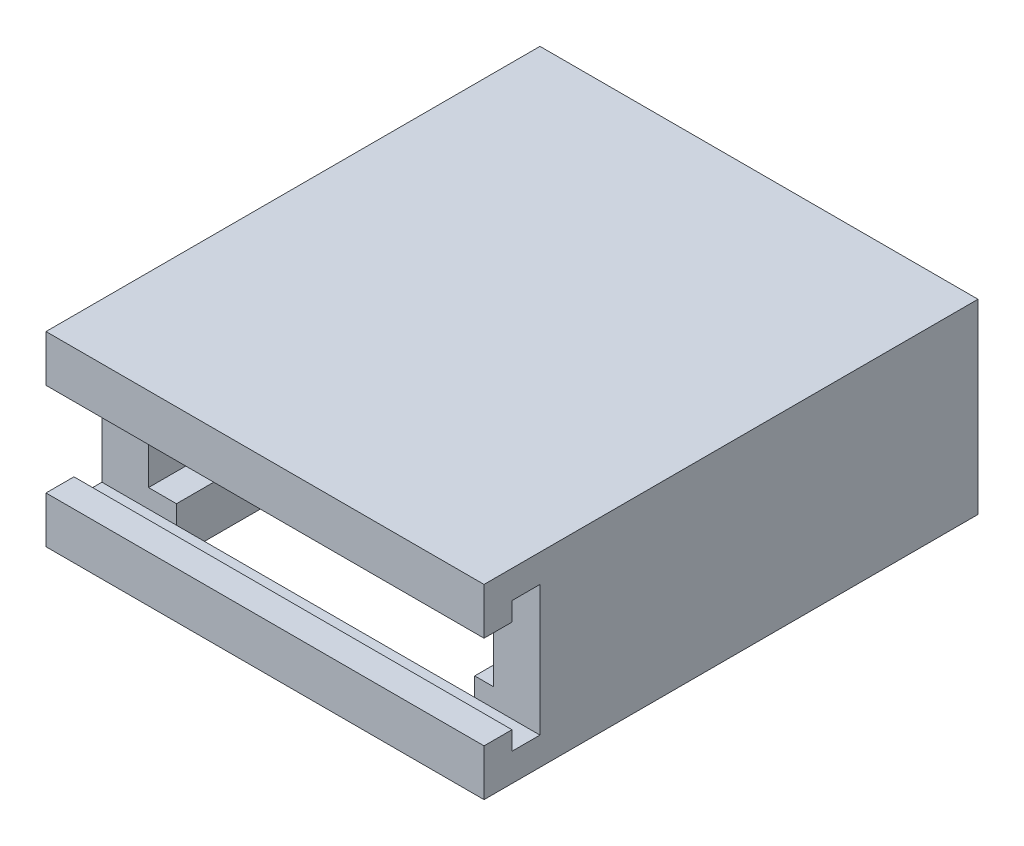
ISO-10303-21;
HEADER;
FILE_DESCRIPTION(('STEP AP214'),'2;1');
FILE_NAME('part.step','',(''),(''),'','','');
FILE_SCHEMA(('AUTOMOTIVE_DESIGN { 1 0 10303 214 1 1 1 1 }'));
ENDSEC;
DATA;
#1=APPLICATION_CONTEXT('core data for automotive mechanical design processes');
#2=APPLICATION_PROTOCOL_DEFINITION('international standard','automotive_design',2000,#1);
#3=PRODUCT_CONTEXT('',#1,'mechanical');
#4=PRODUCT('Part','Part','',(#3));
#5=PRODUCT_RELATED_PRODUCT_CATEGORY('part','',(#4));
#6=PRODUCT_DEFINITION_FORMATION('','',#4);
#7=PRODUCT_DEFINITION_CONTEXT('part definition',#1,'design');
#8=PRODUCT_DEFINITION('design','',#6,#7);
#9=PRODUCT_DEFINITION_SHAPE('','',#8);
#10=(LENGTH_UNIT() NAMED_UNIT(*) SI_UNIT(.MILLI.,.METRE.));
#11=(NAMED_UNIT(*) PLANE_ANGLE_UNIT() SI_UNIT($,.RADIAN.));
#12=(NAMED_UNIT(*) SI_UNIT($,.STERADIAN.) SOLID_ANGLE_UNIT());
#13=UNCERTAINTY_MEASURE_WITH_UNIT(LENGTH_MEASURE(1.E-05),#10,'distance_accuracy_value','');
#14=(GEOMETRIC_REPRESENTATION_CONTEXT(3) GLOBAL_UNCERTAINTY_ASSIGNED_CONTEXT((#13)) GLOBAL_UNIT_ASSIGNED_CONTEXT((#10,
#11,#12)) REPRESENTATION_CONTEXT('',''));
#15=CARTESIAN_POINT('',(0.,0.,0.));
#16=DIRECTION('',(0.,0.,1.));
#17=DIRECTION('',(1.,0.,0.));
#18=AXIS2_PLACEMENT_3D('',#15,#16,#17);
#19=CARTESIAN_POINT('',(0.,0.,42.));
#20=DIRECTION('',(0.,0.,1.));
#21=DIRECTION('',(1.,0.,0.));
#22=AXIS2_PLACEMENT_3D('',#19,#20,#21);
#23=PLANE('',#22);
#24=DIRECTION('',(-1.,0.,0.));
#25=VECTOR('',#24,1.);
#26=CARTESIAN_POINT('',(42.,-2.,42.));
#27=LINE('',#26,#25);
#28=CARTESIAN_POINT('',(42.,-2.,42.));
#29=VERTEX_POINT('',#28);
#30=CARTESIAN_POINT('',(35.,-2.,42.));
#31=VERTEX_POINT('',#30);
#32=EDGE_CURVE('E54',#29,#31,#27,.T.);
#33=ORIENTED_EDGE('',*,*,#32,.F.);
#34=DIRECTION('',(0.,1.,0.));
#35=VECTOR('',#34,1.);
#36=CARTESIAN_POINT('',(42.,0.,42.));
#37=LINE('',#36,#35);
#38=CARTESIAN_POINT('',(42.,12.,42.));
#39=VERTEX_POINT('',#38);
#40=EDGE_CURVE('E196',#29,#39,#37,.T.);
#41=ORIENTED_EDGE('',*,*,#40,.T.);
#42=DIRECTION('',(-1.,0.,0.));
#43=VECTOR('',#42,1.);
#44=CARTESIAN_POINT('',(42.,12.,42.));
#45=LINE('',#44,#43);
#46=CARTESIAN_POINT('',(-5.,12.,42.));
#47=VERTEX_POINT('',#46);
#48=EDGE_CURVE('E357',#39,#47,#45,.T.);
#49=ORIENTED_EDGE('',*,*,#48,.T.);
#50=DIRECTION('',(0.,1.,0.));
#51=VECTOR('',#50,1.);
#52=CARTESIAN_POINT('',(-5.,0.,42.));
#53=LINE('',#52,#51);
#54=CARTESIAN_POINT('',(-5.,-2.,42.));
#55=VERTEX_POINT('',#54);
#56=EDGE_CURVE('E62',#55,#47,#53,.T.);
#57=ORIENTED_EDGE('',*,*,#56,.F.);
#58=CARTESIAN_POINT('',(3.,-2.,42.));
#59=VERTEX_POINT('',#58);
#60=EDGE_CURVE('E204',#59,#55,#27,.T.);
#61=ORIENTED_EDGE('',*,*,#60,.F.);
#62=DIRECTION('',(0.,1.,0.));
#63=VECTOR('',#62,1.);
#64=CARTESIAN_POINT('',(3.,-5.,42.));
#65=LINE('',#64,#63);
#66=CARTESIAN_POINT('',(3.,0.,42.));
#67=VERTEX_POINT('',#66);
#68=EDGE_CURVE('E295',#59,#67,#65,.T.);
#69=ORIENTED_EDGE('',*,*,#68,.T.);
#70=DIRECTION('',(-1.,0.,0.));
#71=VECTOR('',#70,1.);
#72=CARTESIAN_POINT('',(-5.,0.,42.));
#73=LINE('',#72,#71);
#74=CARTESIAN_POINT('',(0.,0.,42.));
#75=VERTEX_POINT('',#74);
#76=EDGE_CURVE('E292',#67,#75,#73,.T.);
#77=ORIENTED_EDGE('',*,*,#76,.T.);
#78=DIRECTION('',(0.,1.,0.));
#79=VECTOR('',#78,1.);
#80=CARTESIAN_POINT('',(0.,0.,42.));
#81=LINE('',#80,#79);
#82=CARTESIAN_POINT('',(0.,10.,42.));
#83=VERTEX_POINT('',#82);
#84=EDGE_CURVE('E211',#75,#83,#81,.T.);
#85=ORIENTED_EDGE('',*,*,#84,.T.);
#86=DIRECTION('',(1.,0.,0.));
#87=VECTOR('',#86,1.);
#88=CARTESIAN_POINT('',(0.,10.,42.));
#89=LINE('',#88,#87);
#90=CARTESIAN_POINT('',(37.,10.,42.));
#91=VERTEX_POINT('',#90);
#92=EDGE_CURVE('E220',#83,#91,#89,.T.);
#93=ORIENTED_EDGE('',*,*,#92,.T.);
#94=DIRECTION('',(0.,1.,0.));
#95=VECTOR('',#94,1.);
#96=CARTESIAN_POINT('',(37.,0.,42.));
#97=LINE('',#96,#95);
#98=CARTESIAN_POINT('',(37.,0.,42.));
#99=VERTEX_POINT('',#98);
#100=EDGE_CURVE('E222',#99,#91,#97,.T.);
#101=ORIENTED_EDGE('',*,*,#100,.F.);
#102=DIRECTION('',(-1.,0.,0.));
#103=VECTOR('',#102,1.);
#104=CARTESIAN_POINT('',(42.,0.,42.));
#105=LINE('',#104,#103);
#106=CARTESIAN_POINT('',(35.,0.,42.));
#107=VERTEX_POINT('',#106);
#108=EDGE_CURVE('E264',#99,#107,#105,.T.);
#109=ORIENTED_EDGE('',*,*,#108,.T.);
#110=DIRECTION('',(0.,1.,0.));
#111=VECTOR('',#110,1.);
#112=CARTESIAN_POINT('',(35.,-5.,42.));
#113=LINE('',#112,#111);
#114=EDGE_CURVE('E199',#31,#107,#113,.T.);
#115=ORIENTED_EDGE('',*,*,#114,.F.);
#116=EDGE_LOOP('',(#33,#41,#49,#57,#61,#69,#77,#85,#93,#101,#109,#115));
#117=FACE_BOUND('',#116,.T.);
#118=ADVANCED_FACE('F39',(#117),#23,.T.);
#119=CARTESIAN_POINT('',(42.,0.,42.));
#120=DIRECTION('',(-1.,0.,0.));
#121=DIRECTION('',(0.,0.,1.));
#122=AXIS2_PLACEMENT_3D('',#119,#120,#121);
#123=PLANE('',#122);
#124=DIRECTION('',(0.,0.,1.));
#125=VECTOR('',#124,1.);
#126=CARTESIAN_POINT('',(42.,-5.,0.));
#127=LINE('',#126,#125);
#128=CARTESIAN_POINT('',(42.,-5.,-5.));
#129=VERTEX_POINT('',#128);
#130=CARTESIAN_POINT('',(42.,-5.,48.));
#131=VERTEX_POINT('',#130);
#132=EDGE_CURVE('E275',#129,#131,#127,.T.);
#133=ORIENTED_EDGE('',*,*,#132,.F.);
#134=DIRECTION('',(0.,-1.,0.));
#135=VECTOR('',#134,1.);
#136=CARTESIAN_POINT('',(42.,15.,-5.));
#137=LINE('',#136,#135);
#138=CARTESIAN_POINT('',(42.,15.,-5.));
#139=VERTEX_POINT('',#138);
#140=EDGE_CURVE('E273',#139,#129,#137,.T.);
#141=ORIENTED_EDGE('',*,*,#140,.F.);
#142=DIRECTION('',(0.,0.,-1.));
#143=VECTOR('',#142,1.);
#144=CARTESIAN_POINT('',(42.,15.,42.));
#145=LINE('',#144,#143);
#146=CARTESIAN_POINT('',(42.,15.,48.));
#147=VERTEX_POINT('',#146);
#148=EDGE_CURVE('E11',#147,#139,#145,.T.);
#149=ORIENTED_EDGE('',*,*,#148,.F.);
#150=DIRECTION('',(0.,1.,0.));
#151=VECTOR('',#150,1.);
#152=CARTESIAN_POINT('',(42.,15.,48.));
#153=LINE('',#152,#151);
#154=CARTESIAN_POINT('',(42.,10.,48.));
#155=VERTEX_POINT('',#154);
#156=EDGE_CURVE('E354',#155,#147,#153,.T.);
#157=ORIENTED_EDGE('',*,*,#156,.F.);
#158=DIRECTION('',(0.,0.,1.));
#159=VECTOR('',#158,1.);
#160=CARTESIAN_POINT('',(42.,10.,48.));
#161=LINE('',#160,#159);
#162=CARTESIAN_POINT('',(42.,10.,45.));
#163=VERTEX_POINT('',#162);
#164=EDGE_CURVE('E351',#163,#155,#161,.T.);
#165=ORIENTED_EDGE('',*,*,#164,.F.);
#166=DIRECTION('',(0.,-1.,0.));
#167=VECTOR('',#166,1.);
#168=CARTESIAN_POINT('',(42.,10.,45.));
#169=LINE('',#168,#167);
#170=CARTESIAN_POINT('',(42.,12.,45.));
#171=VERTEX_POINT('',#170);
#172=EDGE_CURVE('E348',#171,#163,#169,.T.);
#173=ORIENTED_EDGE('',*,*,#172,.F.);
#174=DIRECTION('',(0.,0.,1.));
#175=VECTOR('',#174,1.);
#176=CARTESIAN_POINT('',(42.,12.,45.));
#177=LINE('',#176,#175);
#178=EDGE_CURVE('E208',#39,#171,#177,.T.);
#179=ORIENTED_EDGE('',*,*,#178,.F.);
#180=ORIENTED_EDGE('',*,*,#40,.F.);
#181=DIRECTION('',(0.,0.,-1.));
#182=VECTOR('',#181,1.);
#183=CARTESIAN_POINT('',(42.,-2.,45.));
#184=LINE('',#183,#182);
#185=CARTESIAN_POINT('',(42.,-2.,45.));
#186=VERTEX_POINT('',#185);
#187=EDGE_CURVE('E182',#186,#29,#184,.T.);
#188=ORIENTED_EDGE('',*,*,#187,.F.);
#189=DIRECTION('',(0.,-1.,0.));
#190=VECTOR('',#189,1.);
#191=CARTESIAN_POINT('',(42.,0.,45.));
#192=LINE('',#191,#190);
#193=CARTESIAN_POINT('',(42.,0.,45.));
#194=VERTEX_POINT('',#193);
#195=EDGE_CURVE('E405',#194,#186,#192,.T.);
#196=ORIENTED_EDGE('',*,*,#195,.F.);
#197=DIRECTION('',(0.,0.,-1.));
#198=VECTOR('',#197,1.);
#199=CARTESIAN_POINT('',(42.,0.,48.));
#200=LINE('',#199,#198);
#201=CARTESIAN_POINT('',(42.,0.,48.));
#202=VERTEX_POINT('',#201);
#203=EDGE_CURVE('E402',#202,#194,#200,.T.);
#204=ORIENTED_EDGE('',*,*,#203,.F.);
#205=DIRECTION('',(0.,1.,0.));
#206=VECTOR('',#205,1.);
#207=CARTESIAN_POINT('',(42.,-5.,48.));
#208=LINE('',#207,#206);
#209=EDGE_CURVE('E190',#131,#202,#208,.T.);
#210=ORIENTED_EDGE('',*,*,#209,.F.);
#211=EDGE_LOOP('',(#133,#141,#149,#157,#165,#173,#179,#180,#188,#196,#204,#210));
#212=FACE_BOUND('',#211,.T.);
#213=ADVANCED_FACE('F41',(#212),#123,.F.);
#214=CARTESIAN_POINT('',(0.,15.,42.));
#215=DIRECTION('',(0.,1.,0.));
#216=DIRECTION('',(0.,0.,1.));
#217=AXIS2_PLACEMENT_3D('',#214,#215,#216);
#218=PLANE('',#217);
#219=ORIENTED_EDGE('',*,*,#148,.T.);
#220=DIRECTION('',(1.,0.,0.));
#221=VECTOR('',#220,1.);
#222=CARTESIAN_POINT('',(42.,15.,-5.));
#223=LINE('',#222,#221);
#224=CARTESIAN_POINT('',(-5.,15.,-5.));
#225=VERTEX_POINT('',#224);
#226=EDGE_CURVE('E258',#225,#139,#223,.T.);
#227=ORIENTED_EDGE('',*,*,#226,.F.);
#228=DIRECTION('',(0.,0.,-1.));
#229=VECTOR('',#228,1.);
#230=CARTESIAN_POINT('',(-5.,15.,42.));
#231=LINE('',#230,#229);
#232=CARTESIAN_POINT('',(-5.,15.,48.));
#233=VERTEX_POINT('',#232);
#234=EDGE_CURVE('E47',#233,#225,#231,.T.);
#235=ORIENTED_EDGE('',*,*,#234,.F.);
#236=DIRECTION('',(-1.,0.,0.));
#237=VECTOR('',#236,1.);
#238=CARTESIAN_POINT('',(42.,15.,48.));
#239=LINE('',#238,#237);
#240=EDGE_CURVE('E274',#147,#233,#239,.T.);
#241=ORIENTED_EDGE('',*,*,#240,.F.);
#242=EDGE_LOOP('',(#219,#227,#235,#241));
#243=FACE_BOUND('',#242,.T.);
#244=ADVANCED_FACE('F263',(#243),#218,.T.);
#245=CARTESIAN_POINT('',(-5.,0.,42.));
#246=DIRECTION('',(-1.,0.,0.));
#247=DIRECTION('',(0.,0.,1.));
#248=AXIS2_PLACEMENT_3D('',#245,#246,#247);
#249=PLANE('',#248);
#250=ORIENTED_EDGE('',*,*,#234,.T.);
#251=DIRECTION('',(0.,1.,0.));
#252=VECTOR('',#251,1.);
#253=CARTESIAN_POINT('',(-5.,15.,-5.));
#254=LINE('',#253,#252);
#255=CARTESIAN_POINT('',(-5.,-5.,-5.));
#256=VERTEX_POINT('',#255);
#257=EDGE_CURVE('E245',#256,#225,#254,.T.);
#258=ORIENTED_EDGE('',*,*,#257,.F.);
#259=DIRECTION('',(0.,0.,-1.));
#260=VECTOR('',#259,1.);
#261=CARTESIAN_POINT('',(-5.,-5.,42.));
#262=LINE('',#261,#260);
#263=CARTESIAN_POINT('',(-5.,-5.,48.));
#264=VERTEX_POINT('',#263);
#265=EDGE_CURVE('E289',#264,#256,#262,.T.);
#266=ORIENTED_EDGE('',*,*,#265,.F.);
#267=DIRECTION('',(0.,1.,0.));
#268=VECTOR('',#267,1.);
#269=CARTESIAN_POINT('',(-5.,-5.,48.));
#270=LINE('',#269,#268);
#271=CARTESIAN_POINT('',(-5.,0.,48.));
#272=VERTEX_POINT('',#271);
#273=EDGE_CURVE('E383',#264,#272,#270,.T.);
#274=ORIENTED_EDGE('',*,*,#273,.T.);
#275=DIRECTION('',(0.,0.,-1.));
#276=VECTOR('',#275,1.);
#277=CARTESIAN_POINT('',(-5.,0.,48.));
#278=LINE('',#277,#276);
#279=CARTESIAN_POINT('',(-5.,0.,45.));
#280=VERTEX_POINT('',#279);
#281=EDGE_CURVE('E386',#272,#280,#278,.T.);
#282=ORIENTED_EDGE('',*,*,#281,.T.);
#283=DIRECTION('',(0.,-1.,0.));
#284=VECTOR('',#283,1.);
#285=CARTESIAN_POINT('',(-5.,0.,45.));
#286=LINE('',#285,#284);
#287=CARTESIAN_POINT('',(-5.,-2.,45.));
#288=VERTEX_POINT('',#287);
#289=EDGE_CURVE('E191',#280,#288,#286,.T.);
#290=ORIENTED_EDGE('',*,*,#289,.T.);
#291=DIRECTION('',(0.,0.,-1.));
#292=VECTOR('',#291,1.);
#293=CARTESIAN_POINT('',(-5.,-2.,45.));
#294=LINE('',#293,#292);
#295=EDGE_CURVE('E389',#288,#55,#294,.T.);
#296=ORIENTED_EDGE('',*,*,#295,.T.);
#297=ORIENTED_EDGE('',*,*,#56,.T.);
#298=DIRECTION('',(0.,0.,1.));
#299=VECTOR('',#298,1.);
#300=CARTESIAN_POINT('',(-5.,12.,45.));
#301=LINE('',#300,#299);
#302=CARTESIAN_POINT('',(-5.,12.,45.));
#303=VERTEX_POINT('',#302);
#304=EDGE_CURVE('E358',#47,#303,#301,.T.);
#305=ORIENTED_EDGE('',*,*,#304,.T.);
#306=DIRECTION('',(0.,-1.,0.));
#307=VECTOR('',#306,1.);
#308=CARTESIAN_POINT('',(-5.,10.,45.));
#309=LINE('',#308,#307);
#310=CARTESIAN_POINT('',(-5.,10.,45.));
#311=VERTEX_POINT('',#310);
#312=EDGE_CURVE('E360',#303,#311,#309,.T.);
#313=ORIENTED_EDGE('',*,*,#312,.T.);
#314=DIRECTION('',(0.,0.,1.));
#315=VECTOR('',#314,1.);
#316=CARTESIAN_POINT('',(-5.,10.,48.));
#317=LINE('',#316,#315);
#318=CARTESIAN_POINT('',(-5.,10.,48.));
#319=VERTEX_POINT('',#318);
#320=EDGE_CURVE('E363',#311,#319,#317,.T.);
#321=ORIENTED_EDGE('',*,*,#320,.T.);
#322=DIRECTION('',(0.,1.,0.));
#323=VECTOR('',#322,1.);
#324=CARTESIAN_POINT('',(-5.,15.,48.));
#325=LINE('',#324,#323);
#326=EDGE_CURVE('E248',#319,#233,#325,.T.);
#327=ORIENTED_EDGE('',*,*,#326,.T.);
#328=EDGE_LOOP('',(#250,#258,#266,#274,#282,#290,#296,#297,#305,#313,#321,#327));
#329=FACE_BOUND('',#328,.T.);
#330=ADVANCED_FACE('F244',(#329),#249,.T.);
#331=CARTESIAN_POINT('',(0.,0.,42.));
#332=DIRECTION('',(-1.,0.,0.));
#333=DIRECTION('',(0.,0.,1.));
#334=AXIS2_PLACEMENT_3D('',#331,#332,#333);
#335=PLANE('',#334);
#336=DIRECTION('',(0.,1.,0.));
#337=VECTOR('',#336,1.);
#338=CARTESIAN_POINT('',(0.,0.,0.));
#339=LINE('',#338,#337);
#340=CARTESIAN_POINT('',(0.,0.,0.));
#341=VERTEX_POINT('',#340);
#342=CARTESIAN_POINT('',(0.,10.,0.));
#343=VERTEX_POINT('',#342);
#344=EDGE_CURVE('E226',#341,#343,#339,.T.);
#345=ORIENTED_EDGE('',*,*,#344,.T.);
#346=DIRECTION('',(0.,0.,-1.));
#347=VECTOR('',#346,1.);
#348=CARTESIAN_POINT('',(0.,10.,42.));
#349=LINE('',#348,#347);
#350=EDGE_CURVE('E236',#83,#343,#349,.T.);
#351=ORIENTED_EDGE('',*,*,#350,.F.);
#352=ORIENTED_EDGE('',*,*,#84,.F.);
#353=DIRECTION('',(0.,0.,-1.));
#354=VECTOR('',#353,1.);
#355=CARTESIAN_POINT('',(0.,0.,42.));
#356=LINE('',#355,#354);
#357=EDGE_CURVE('E239',#75,#341,#356,.T.);
#358=ORIENTED_EDGE('',*,*,#357,.T.);
#359=EDGE_LOOP('',(#345,#351,#352,#358));
#360=FACE_BOUND('',#359,.T.);
#361=ADVANCED_FACE('F317',(#360),#335,.F.);
#362=CARTESIAN_POINT('',(0.,10.,42.));
#363=DIRECTION('',(0.,1.,0.));
#364=DIRECTION('',(0.,0.,1.));
#365=AXIS2_PLACEMENT_3D('',#362,#363,#364);
#366=PLANE('',#365);
#367=DIRECTION('',(1.,0.,0.));
#368=VECTOR('',#367,1.);
#369=CARTESIAN_POINT('',(0.,10.,0.));
#370=LINE('',#369,#368);
#371=CARTESIAN_POINT('',(37.,10.,0.));
#372=VERTEX_POINT('',#371);
#373=EDGE_CURVE('E213',#343,#372,#370,.T.);
#374=ORIENTED_EDGE('',*,*,#373,.T.);
#375=DIRECTION('',(0.,0.,-1.));
#376=VECTOR('',#375,1.);
#377=CARTESIAN_POINT('',(37.,10.,42.));
#378=LINE('',#377,#376);
#379=EDGE_CURVE('E233',#91,#372,#378,.T.);
#380=ORIENTED_EDGE('',*,*,#379,.F.);
#381=ORIENTED_EDGE('',*,*,#92,.F.);
#382=ORIENTED_EDGE('',*,*,#350,.T.);
#383=EDGE_LOOP('',(#374,#380,#381,#382));
#384=FACE_BOUND('',#383,.T.);
#385=ADVANCED_FACE('F324',(#384),#366,.F.);
#386=CARTESIAN_POINT('',(37.,0.,42.));
#387=DIRECTION('',(-1.,0.,0.));
#388=DIRECTION('',(0.,0.,1.));
#389=AXIS2_PLACEMENT_3D('',#386,#387,#388);
#390=PLANE('',#389);
#391=DIRECTION('',(0.,1.,0.));
#392=VECTOR('',#391,1.);
#393=CARTESIAN_POINT('',(37.,0.,0.));
#394=LINE('',#393,#392);
#395=CARTESIAN_POINT('',(37.,0.,0.));
#396=VERTEX_POINT('',#395);
#397=EDGE_CURVE('E209',#396,#372,#394,.T.);
#398=ORIENTED_EDGE('',*,*,#397,.F.);
#399=DIRECTION('',(0.,0.,-1.));
#400=VECTOR('',#399,1.);
#401=CARTESIAN_POINT('',(37.,0.,42.));
#402=LINE('',#401,#400);
#403=EDGE_CURVE('E225',#99,#396,#402,.T.);
#404=ORIENTED_EDGE('',*,*,#403,.F.);
#405=ORIENTED_EDGE('',*,*,#100,.T.);
#406=ORIENTED_EDGE('',*,*,#379,.T.);
#407=EDGE_LOOP('',(#398,#404,#405,#406));
#408=FACE_BOUND('',#407,.T.);
#409=ADVANCED_FACE('F327',(#408),#390,.T.);
#410=CARTESIAN_POINT('',(0.,0.,0.));
#411=DIRECTION('',(0.,-1.,0.));
#412=DIRECTION('',(0.,0.,-1.));
#413=AXIS2_PLACEMENT_3D('',#410,#411,#412);
#414=PLANE('',#413);
#415=DIRECTION('',(1.,0.,0.));
#416=VECTOR('',#415,1.);
#417=CARTESIAN_POINT('',(-5.,0.,0.));
#418=LINE('',#417,#416);
#419=CARTESIAN_POINT('',(3.00000000000001,0.,0.));
#420=VERTEX_POINT('',#419);
#421=EDGE_CURVE('E288',#341,#420,#418,.T.);
#422=ORIENTED_EDGE('',*,*,#421,.F.);
#423=ORIENTED_EDGE('',*,*,#357,.F.);
#424=ORIENTED_EDGE('',*,*,#76,.F.);
#425=DIRECTION('',(0.,0.,1.));
#426=VECTOR('',#425,1.);
#427=CARTESIAN_POINT('',(3.,0.,42.));
#428=LINE('',#427,#426);
#429=EDGE_CURVE('E297',#420,#67,#428,.T.);
#430=ORIENTED_EDGE('',*,*,#429,.F.);
#431=EDGE_LOOP('',(#422,#423,#424,#430));
#432=FACE_BOUND('',#431,.T.);
#433=ADVANCED_FACE('F315',(#432),#414,.F.);
#434=CARTESIAN_POINT('',(3.,-5.,42.));
#435=DIRECTION('',(-1.,0.,0.));
#436=DIRECTION('',(0.,0.,1.));
#437=AXIS2_PLACEMENT_3D('',#434,#435,#436);
#438=PLANE('',#437);
#439=ORIENTED_EDGE('',*,*,#429,.T.);
#440=ORIENTED_EDGE('',*,*,#68,.F.);
#441=CARTESIAN_POINT('',(3.,-5.,42.));
#442=VERTEX_POINT('',#441);
#443=EDGE_CURVE('E301',#442,#59,#65,.T.);
#444=ORIENTED_EDGE('',*,*,#443,.F.);
#445=DIRECTION('',(0.,0.,1.));
#446=VECTOR('',#445,1.);
#447=CARTESIAN_POINT('',(3.,-5.,42.));
#448=LINE('',#447,#446);
#449=CARTESIAN_POINT('',(3.,-5.,0.));
#450=VERTEX_POINT('',#449);
#451=EDGE_CURVE('E291',#450,#442,#448,.T.);
#452=ORIENTED_EDGE('',*,*,#451,.F.);
#453=DIRECTION('',(0.,1.,0.));
#454=VECTOR('',#453,1.);
#455=CARTESIAN_POINT('',(3.00000000000001,-5.,0.));
#456=LINE('',#455,#454);
#457=EDGE_CURVE('E216',#450,#420,#456,.T.);
#458=ORIENTED_EDGE('',*,*,#457,.T.);
#459=EDGE_LOOP('',(#439,#440,#444,#452,#458));
#460=FACE_BOUND('',#459,.T.);
#461=ADVANCED_FACE('F310',(#460),#438,.F.);
#462=CARTESIAN_POINT('',(0.,-5.,0.));
#463=DIRECTION('',(0.,-1.,0.));
#464=DIRECTION('',(0.,0.,-1.));
#465=AXIS2_PLACEMENT_3D('',#462,#463,#464);
#466=PLANE('',#465);
#467=DIRECTION('',(-1.,0.,0.));
#468=VECTOR('',#467,1.);
#469=CARTESIAN_POINT('',(42.,-5.,48.));
#470=LINE('',#469,#468);
#471=EDGE_CURVE('E340',#131,#264,#470,.T.);
#472=ORIENTED_EDGE('',*,*,#471,.T.);
#473=ORIENTED_EDGE('',*,*,#265,.T.);
#474=DIRECTION('',(-1.,0.,0.));
#475=VECTOR('',#474,1.);
#476=CARTESIAN_POINT('',(42.,-5.,-5.));
#477=LINE('',#476,#475);
#478=EDGE_CURVE('E261',#129,#256,#477,.T.);
#479=ORIENTED_EDGE('',*,*,#478,.F.);
#480=ORIENTED_EDGE('',*,*,#132,.T.);
#481=EDGE_LOOP('',(#472,#473,#479,#480));
#482=FACE_BOUND('',#481,.T.);
#483=ORIENTED_EDGE('',*,*,#451,.T.);
#484=DIRECTION('',(-1.,0.,0.));
#485=VECTOR('',#484,1.);
#486=CARTESIAN_POINT('',(42.,-5.,42.));
#487=LINE('',#486,#485);
#488=CARTESIAN_POINT('',(35.,-5.,42.));
#489=VERTEX_POINT('',#488);
#490=EDGE_CURVE('E201',#489,#442,#487,.T.);
#491=ORIENTED_EDGE('',*,*,#490,.F.);
#492=DIRECTION('',(0.,0.,-1.));
#493=VECTOR('',#492,1.);
#494=CARTESIAN_POINT('',(35.,-5.,0.));
#495=LINE('',#494,#493);
#496=CARTESIAN_POINT('',(35.,-5.,0.));
#497=VERTEX_POINT('',#496);
#498=EDGE_CURVE('E277',#489,#497,#495,.T.);
#499=ORIENTED_EDGE('',*,*,#498,.T.);
#500=DIRECTION('',(-1.,0.,0.));
#501=VECTOR('',#500,1.);
#502=CARTESIAN_POINT('',(42.,-5.,0.));
#503=LINE('',#502,#501);
#504=EDGE_CURVE('E270',#497,#450,#503,.T.);
#505=ORIENTED_EDGE('',*,*,#504,.T.);
#506=EDGE_LOOP('',(#483,#491,#499,#505));
#507=FACE_BOUND('',#506,.T.);
#508=ADVANCED_FACE('F339',(#482,#507),#466,.T.);
#509=CARTESIAN_POINT('',(35.,-5.,0.));
#510=DIRECTION('',(1.,0.,0.));
#511=DIRECTION('',(0.,0.,-1.));
#512=AXIS2_PLACEMENT_3D('',#509,#510,#511);
#513=PLANE('',#512);
#514=DIRECTION('',(0.,0.,-1.));
#515=VECTOR('',#514,1.);
#516=CARTESIAN_POINT('',(35.,0.,0.));
#517=LINE('',#516,#515);
#518=CARTESIAN_POINT('',(35.,0.,0.));
#519=VERTEX_POINT('',#518);
#520=EDGE_CURVE('E266',#107,#519,#517,.T.);
#521=ORIENTED_EDGE('',*,*,#520,.T.);
#522=DIRECTION('',(0.,1.,0.));
#523=VECTOR('',#522,1.);
#524=CARTESIAN_POINT('',(35.,-5.,0.));
#525=LINE('',#524,#523);
#526=EDGE_CURVE('E280',#497,#519,#525,.T.);
#527=ORIENTED_EDGE('',*,*,#526,.F.);
#528=ORIENTED_EDGE('',*,*,#498,.F.);
#529=EDGE_CURVE('E286',#489,#31,#113,.T.);
#530=ORIENTED_EDGE('',*,*,#529,.T.);
#531=ORIENTED_EDGE('',*,*,#114,.T.);
#532=EDGE_LOOP('',(#521,#527,#528,#530,#531));
#533=FACE_BOUND('',#532,.T.);
#534=ADVANCED_FACE('F334',(#533),#513,.F.);
#535=CARTESIAN_POINT('',(0.,0.,0.));
#536=DIRECTION('',(0.,-1.,0.));
#537=DIRECTION('',(0.,0.,-1.));
#538=AXIS2_PLACEMENT_3D('',#535,#536,#537);
#539=PLANE('',#538);
#540=ORIENTED_EDGE('',*,*,#403,.T.);
#541=DIRECTION('',(1.,0.,0.));
#542=VECTOR('',#541,1.);
#543=CARTESIAN_POINT('',(42.,0.,0.));
#544=LINE('',#543,#542);
#545=EDGE_CURVE('E278',#519,#396,#544,.T.);
#546=ORIENTED_EDGE('',*,*,#545,.F.);
#547=ORIENTED_EDGE('',*,*,#520,.F.);
#548=ORIENTED_EDGE('',*,*,#108,.F.);
#549=EDGE_LOOP('',(#540,#546,#547,#548));
#550=FACE_BOUND('',#549,.T.);
#551=ADVANCED_FACE('F330',(#550),#539,.F.);
#552=CARTESIAN_POINT('',(0.,0.,0.));
#553=DIRECTION('',(0.,0.,-1.));
#554=DIRECTION('',(-1.,0.,0.));
#555=AXIS2_PLACEMENT_3D('',#552,#553,#554);
#556=PLANE('',#555);
#557=ORIENTED_EDGE('',*,*,#504,.F.);
#558=ORIENTED_EDGE('',*,*,#526,.T.);
#559=ORIENTED_EDGE('',*,*,#545,.T.);
#560=ORIENTED_EDGE('',*,*,#397,.T.);
#561=ORIENTED_EDGE('',*,*,#373,.F.);
#562=ORIENTED_EDGE('',*,*,#344,.F.);
#563=ORIENTED_EDGE('',*,*,#421,.T.);
#564=ORIENTED_EDGE('',*,*,#457,.F.);
#565=EDGE_LOOP('',(#557,#558,#559,#560,#561,#562,#563,#564));
#566=FACE_BOUND('',#565,.T.);
#567=ADVANCED_FACE('F424',(#566),#556,.F.);
#568=CARTESIAN_POINT('',(0.,0.,-5.));
#569=DIRECTION('',(0.,0.,-1.));
#570=DIRECTION('',(-1.,0.,0.));
#571=AXIS2_PLACEMENT_3D('',#568,#569,#570);
#572=PLANE('',#571);
#573=ORIENTED_EDGE('',*,*,#140,.T.);
#574=ORIENTED_EDGE('',*,*,#478,.T.);
#575=ORIENTED_EDGE('',*,*,#257,.T.);
#576=ORIENTED_EDGE('',*,*,#226,.T.);
#577=EDGE_LOOP('',(#573,#574,#575,#576));
#578=FACE_BOUND('',#577,.T.);
#579=ADVANCED_FACE('F257',(#578),#572,.T.);
#580=CARTESIAN_POINT('',(42.,15.,48.));
#581=DIRECTION('',(0.,0.,1.));
#582=DIRECTION('',(1.,0.,0.));
#583=AXIS2_PLACEMENT_3D('',#580,#581,#582);
#584=PLANE('',#583);
#585=ORIENTED_EDGE('',*,*,#326,.F.);
#586=DIRECTION('',(-1.,0.,0.));
#587=VECTOR('',#586,1.);
#588=CARTESIAN_POINT('',(42.,10.,48.));
#589=LINE('',#588,#587);
#590=EDGE_CURVE('E367',#155,#319,#589,.T.);
#591=ORIENTED_EDGE('',*,*,#590,.F.);
#592=ORIENTED_EDGE('',*,*,#156,.T.);
#593=ORIENTED_EDGE('',*,*,#240,.T.);
#594=EDGE_LOOP('',(#585,#591,#592,#593));
#595=FACE_BOUND('',#594,.T.);
#596=ADVANCED_FACE('F416',(#595),#584,.T.);
#597=CARTESIAN_POINT('',(42.,10.,48.));
#598=DIRECTION('',(0.,-1.,0.));
#599=DIRECTION('',(0.,0.,-1.));
#600=AXIS2_PLACEMENT_3D('',#597,#598,#599);
#601=PLANE('',#600);
#602=ORIENTED_EDGE('',*,*,#320,.F.);
#603=DIRECTION('',(-1.,0.,0.));
#604=VECTOR('',#603,1.);
#605=CARTESIAN_POINT('',(42.,10.,45.));
#606=LINE('',#605,#604);
#607=EDGE_CURVE('E369',#163,#311,#606,.T.);
#608=ORIENTED_EDGE('',*,*,#607,.F.);
#609=ORIENTED_EDGE('',*,*,#164,.T.);
#610=ORIENTED_EDGE('',*,*,#590,.T.);
#611=EDGE_LOOP('',(#602,#608,#609,#610));
#612=FACE_BOUND('',#611,.T.);
#613=ADVANCED_FACE('F414',(#612),#601,.T.);
#614=CARTESIAN_POINT('',(42.,10.,45.));
#615=DIRECTION('',(0.,0.,-1.));
#616=DIRECTION('',(-1.,0.,0.));
#617=AXIS2_PLACEMENT_3D('',#614,#615,#616);
#618=PLANE('',#617);
#619=ORIENTED_EDGE('',*,*,#312,.F.);
#620=DIRECTION('',(-1.,0.,0.));
#621=VECTOR('',#620,1.);
#622=CARTESIAN_POINT('',(42.,12.,45.));
#623=LINE('',#622,#621);
#624=EDGE_CURVE('E371',#171,#303,#623,.T.);
#625=ORIENTED_EDGE('',*,*,#624,.F.);
#626=ORIENTED_EDGE('',*,*,#172,.T.);
#627=ORIENTED_EDGE('',*,*,#607,.T.);
#628=EDGE_LOOP('',(#619,#625,#626,#627));
#629=FACE_BOUND('',#628,.T.);
#630=ADVANCED_FACE('F411',(#629),#618,.T.);
#631=CARTESIAN_POINT('',(42.,12.,45.));
#632=DIRECTION('',(0.,-1.,0.));
#633=DIRECTION('',(0.,0.,-1.));
#634=AXIS2_PLACEMENT_3D('',#631,#632,#633);
#635=PLANE('',#634);
#636=ORIENTED_EDGE('',*,*,#304,.F.);
#637=ORIENTED_EDGE('',*,*,#48,.F.);
#638=ORIENTED_EDGE('',*,*,#178,.T.);
#639=ORIENTED_EDGE('',*,*,#624,.T.);
#640=EDGE_LOOP('',(#636,#637,#638,#639));
#641=FACE_BOUND('',#640,.T.);
#642=ADVANCED_FACE('F407',(#641),#635,.T.);
#643=CARTESIAN_POINT('',(42.,-2.,42.));
#644=DIRECTION('',(0.,0.,-1.));
#645=DIRECTION('',(-1.,0.,0.));
#646=AXIS2_PLACEMENT_3D('',#643,#644,#645);
#647=PLANE('',#646);
#648=ORIENTED_EDGE('',*,*,#443,.T.);
#649=EDGE_CURVE('E202',#31,#59,#27,.T.);
#650=ORIENTED_EDGE('',*,*,#649,.F.);
#651=ORIENTED_EDGE('',*,*,#529,.F.);
#652=ORIENTED_EDGE('',*,*,#490,.T.);
#653=EDGE_LOOP('',(#648,#650,#651,#652));
#654=FACE_BOUND('',#653,.T.);
#655=ADVANCED_FACE('F337',(#654),#647,.T.);
#656=CARTESIAN_POINT('',(42.,-2.,45.));
#657=DIRECTION('',(0.,1.,0.));
#658=DIRECTION('',(0.,0.,1.));
#659=AXIS2_PLACEMENT_3D('',#656,#657,#658);
#660=PLANE('',#659);
#661=ORIENTED_EDGE('',*,*,#295,.F.);
#662=DIRECTION('',(-1.,0.,0.));
#663=VECTOR('',#662,1.);
#664=CARTESIAN_POINT('',(42.,-2.,45.));
#665=LINE('',#664,#663);
#666=EDGE_CURVE('E185',#186,#288,#665,.T.);
#667=ORIENTED_EDGE('',*,*,#666,.F.);
#668=ORIENTED_EDGE('',*,*,#187,.T.);
#669=ORIENTED_EDGE('',*,*,#32,.T.);
#670=ORIENTED_EDGE('',*,*,#649,.T.);
#671=ORIENTED_EDGE('',*,*,#60,.T.);
#672=EDGE_LOOP('',(#661,#667,#668,#669,#670,#671));
#673=FACE_BOUND('',#672,.T.);
#674=ADVANCED_FACE('F184',(#673),#660,.T.);
#675=CARTESIAN_POINT('',(42.,0.,45.));
#676=DIRECTION('',(0.,0.,-1.));
#677=DIRECTION('',(-1.,0.,0.));
#678=AXIS2_PLACEMENT_3D('',#675,#676,#677);
#679=PLANE('',#678);
#680=ORIENTED_EDGE('',*,*,#289,.F.);
#681=DIRECTION('',(-1.,0.,0.));
#682=VECTOR('',#681,1.);
#683=CARTESIAN_POINT('',(42.,0.,45.));
#684=LINE('',#683,#682);
#685=EDGE_CURVE('E397',#194,#280,#684,.T.);
#686=ORIENTED_EDGE('',*,*,#685,.F.);
#687=ORIENTED_EDGE('',*,*,#195,.T.);
#688=ORIENTED_EDGE('',*,*,#666,.T.);
#689=EDGE_LOOP('',(#680,#686,#687,#688));
#690=FACE_BOUND('',#689,.T.);
#691=ADVANCED_FACE('F404',(#690),#679,.T.);
#692=CARTESIAN_POINT('',(42.,0.,48.));
#693=DIRECTION('',(0.,1.,0.));
#694=DIRECTION('',(0.,0.,1.));
#695=AXIS2_PLACEMENT_3D('',#692,#693,#694);
#696=PLANE('',#695);
#697=ORIENTED_EDGE('',*,*,#281,.F.);
#698=DIRECTION('',(-1.,0.,0.));
#699=VECTOR('',#698,1.);
#700=CARTESIAN_POINT('',(42.,0.,48.));
#701=LINE('',#700,#699);
#702=EDGE_CURVE('E343',#202,#272,#701,.T.);
#703=ORIENTED_EDGE('',*,*,#702,.F.);
#704=ORIENTED_EDGE('',*,*,#203,.T.);
#705=ORIENTED_EDGE('',*,*,#685,.T.);
#706=EDGE_LOOP('',(#697,#703,#704,#705));
#707=FACE_BOUND('',#706,.T.);
#708=ADVANCED_FACE('F401',(#707),#696,.T.);
#709=CARTESIAN_POINT('',(42.,-5.,48.));
#710=DIRECTION('',(0.,0.,1.));
#711=DIRECTION('',(0.,-1.,0.));
#712=AXIS2_PLACEMENT_3D('',#709,#710,#711);
#713=PLANE('',#712);
#714=ORIENTED_EDGE('',*,*,#273,.F.);
#715=ORIENTED_EDGE('',*,*,#471,.F.);
#716=ORIENTED_EDGE('',*,*,#209,.T.);
#717=ORIENTED_EDGE('',*,*,#702,.T.);
#718=EDGE_LOOP('',(#714,#715,#716,#717));
#719=FACE_BOUND('',#718,.T.);
#720=ADVANCED_FACE('F398',(#719),#713,.T.);
#721=CLOSED_SHELL('',(#118,#213,#244,#330,#361,#385,#409,#433,#461,#508,#534,#551,#567,#579,
#596,#613,#630,#642,#655,#674,#691,#708,#720));
#722=MANIFOLD_SOLID_BREP('B2',#721);
#723=ADVANCED_BREP_SHAPE_REPRESENTATION('',(#18,#722),#14);
#724=SHAPE_DEFINITION_REPRESENTATION(#9,#723);
ENDSEC;
END-ISO-10303-21;
